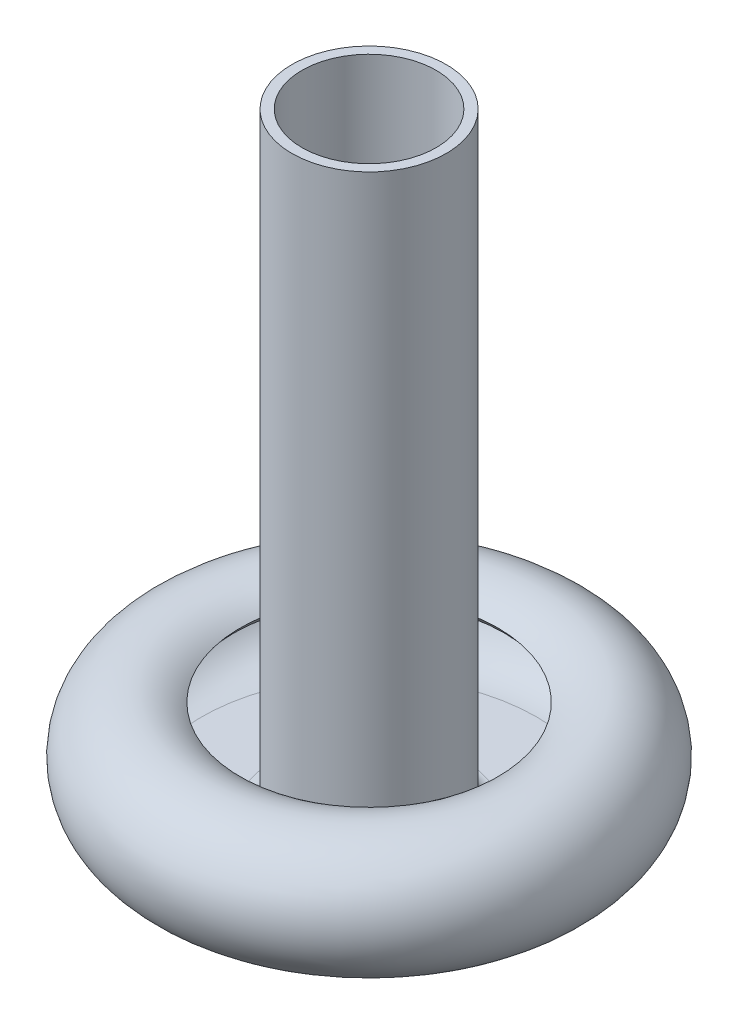
ISO-10303-21;
HEADER;
FILE_DESCRIPTION(('STEP AP214'),'2;1');
FILE_NAME('part.step','',(''),(''),'','','');
FILE_SCHEMA(('AUTOMOTIVE_DESIGN { 1 0 10303 214 1 1 1 1 }'));
ENDSEC;
DATA;
#1=APPLICATION_CONTEXT('core data for automotive mechanical design processes');
#2=APPLICATION_PROTOCOL_DEFINITION('international standard','automotive_design',2000,#1);
#3=PRODUCT_CONTEXT('',#1,'mechanical');
#4=PRODUCT('Part','Part','',(#3));
#5=PRODUCT_RELATED_PRODUCT_CATEGORY('part','',(#4));
#6=PRODUCT_DEFINITION_FORMATION('','',#4);
#7=PRODUCT_DEFINITION_CONTEXT('part definition',#1,'design');
#8=PRODUCT_DEFINITION('design','',#6,#7);
#9=PRODUCT_DEFINITION_SHAPE('','',#8);
#10=(LENGTH_UNIT() NAMED_UNIT(*) SI_UNIT(.MILLI.,.METRE.));
#11=(NAMED_UNIT(*) PLANE_ANGLE_UNIT() SI_UNIT($,.RADIAN.));
#12=(NAMED_UNIT(*) SI_UNIT($,.STERADIAN.) SOLID_ANGLE_UNIT());
#13=UNCERTAINTY_MEASURE_WITH_UNIT(LENGTH_MEASURE(1.E-05),#10,'distance_accuracy_value','');
#14=(GEOMETRIC_REPRESENTATION_CONTEXT(3) GLOBAL_UNCERTAINTY_ASSIGNED_CONTEXT((#13)) GLOBAL_UNIT_ASSIGNED_CONTEXT((#10,
#11,#12)) REPRESENTATION_CONTEXT('',''));
#15=CARTESIAN_POINT('',(0.,0.,0.));
#16=DIRECTION('',(0.,0.,1.));
#17=DIRECTION('',(1.,0.,0.));
#18=AXIS2_PLACEMENT_3D('',#15,#16,#17);
#19=CARTESIAN_POINT('',(0.,-0.15,0.));
#20=DIRECTION('',(0.,1.,0.));
#21=DIRECTION('',(0.,0.,1.));
#22=AXIS2_PLACEMENT_3D('',#19,#20,#21);
#23=PLANE('',#22);
#24=CARTESIAN_POINT('',(0.,-0.15,0.));
#25=DIRECTION('',(0.,1.,0.));
#26=DIRECTION('',(0.,0.,1.));
#27=AXIS2_PLACEMENT_3D('',#24,#25,#26);
#28=CIRCLE('',#27,1.4);
#29=CARTESIAN_POINT('',(0.,-0.15,1.4));
#30=VERTEX_POINT('',#29);
#31=EDGE_CURVE('E229',#30,#30,#28,.T.);
#32=ORIENTED_EDGE('',*,*,#31,.T.);
#33=EDGE_LOOP('',(#32));
#34=FACE_BOUND('',#33,.T.);
#35=CARTESIAN_POINT('',(0.,-0.15,0.));
#36=DIRECTION('',(0.,1.,0.));
#37=DIRECTION('',(0.,0.,1.));
#38=AXIS2_PLACEMENT_3D('',#35,#36,#37);
#39=CIRCLE('',#38,2.5);
#40=CARTESIAN_POINT('',(0.,-0.15,-2.5));
#41=VERTEX_POINT('',#40);
#42=EDGE_CURVE('E171',#41,#41,#39,.T.);
#43=ORIENTED_EDGE('',*,*,#42,.F.);
#44=EDGE_LOOP('',(#43));
#45=FACE_BOUND('',#44,.T.);
#46=ADVANCED_FACE('F163',(#34,#45),#23,.F.);
#47=CARTESIAN_POINT('',(0.,0.,0.));
#48=DIRECTION('',(0.,1.,0.));
#49=DIRECTION('',(0.,0.,1.));
#50=AXIS2_PLACEMENT_3D('',#47,#48,#49);
#51=PLANE('',#50);
#52=CARTESIAN_POINT('',(0.,0.,0.));
#53=DIRECTION('',(0.,1.,0.));
#54=DIRECTION('',(0.,0.,1.));
#55=AXIS2_PLACEMENT_3D('',#52,#53,#54);
#56=CIRCLE('',#55,1.4);
#57=CARTESIAN_POINT('',(0.,0.,1.4));
#58=VERTEX_POINT('',#57);
#59=EDGE_CURVE('E12',#58,#58,#56,.T.);
#60=ORIENTED_EDGE('',*,*,#59,.F.);
#61=EDGE_LOOP('',(#60));
#62=FACE_BOUND('',#61,.T.);
#63=CARTESIAN_POINT('',(0.,0.,0.));
#64=DIRECTION('',(0.,1.,0.));
#65=DIRECTION('',(0.,0.,1.));
#66=AXIS2_PLACEMENT_3D('',#63,#64,#65);
#67=CIRCLE('',#66,2.5);
#68=CARTESIAN_POINT('',(0.,0.,-2.5));
#69=VERTEX_POINT('',#68);
#70=EDGE_CURVE('E250',#69,#69,#67,.T.);
#71=ORIENTED_EDGE('',*,*,#70,.T.);
#72=EDGE_LOOP('',(#71));
#73=FACE_BOUND('',#72,.T.);
#74=ADVANCED_FACE('F165',(#62,#73),#51,.T.);
#75=CARTESIAN_POINT('',(0.,9.1,0.));
#76=DIRECTION('',(0.,-1.,0.));
#77=DIRECTION('',(0.,0.,-1.));
#78=AXIS2_PLACEMENT_3D('',#75,#76,#77);
#79=PLANE('',#78);
#80=CARTESIAN_POINT('',(0.,9.1,0.));
#81=DIRECTION('',(0.,1.,0.));
#82=DIRECTION('',(0.,0.,1.));
#83=AXIS2_PLACEMENT_3D('',#80,#81,#82);
#84=CIRCLE('',#83,1.15);
#85=CARTESIAN_POINT('',(0.,9.1,1.15));
#86=VERTEX_POINT('',#85);
#87=EDGE_CURVE('E234',#86,#86,#84,.T.);
#88=ORIENTED_EDGE('',*,*,#87,.T.);
#89=EDGE_LOOP('',(#88));
#90=FACE_BOUND('',#89,.T.);
#91=CARTESIAN_POINT('',(0.,9.1,0.));
#92=DIRECTION('',(0.,1.,0.));
#93=DIRECTION('',(0.,0.,1.));
#94=AXIS2_PLACEMENT_3D('',#91,#92,#93);
#95=CIRCLE('',#94,1.);
#96=CARTESIAN_POINT('',(0.,9.1,1.));
#97=VERTEX_POINT('',#96);
#98=EDGE_CURVE('E232',#97,#97,#95,.T.);
#99=ORIENTED_EDGE('',*,*,#98,.F.);
#100=EDGE_LOOP('',(#99));
#101=FACE_BOUND('',#100,.T.);
#102=ADVANCED_FACE('F255',(#90,#101),#79,.F.);
#103=CARTESIAN_POINT('',(0.,0.,0.));
#104=DIRECTION('',(0.,1.,0.));
#105=DIRECTION('',(0.,0.,1.));
#106=AXIS2_PLACEMENT_3D('',#103,#104,#105);
#107=CYLINDRICAL_SURFACE('',#106,1.);
#108=DIRECTION('',(0.,1.,0.));
#109=VECTOR('',#108,1.);
#110=CARTESIAN_POINT('',(0.,0.,1.));
#111=LINE('',#110,#109);
#112=CARTESIAN_POINT('',(0.,0.25,1.));
#113=VERTEX_POINT('',#112);
#114=EDGE_CURVE('E226',#113,#97,#111,.T.);
#115=ORIENTED_EDGE('',*,*,#114,.F.);
#116=CARTESIAN_POINT('',(0.,0.25,0.));
#117=DIRECTION('',(0.,1.,0.));
#118=DIRECTION('',(0.,0.,1.));
#119=AXIS2_PLACEMENT_3D('',#116,#117,#118);
#120=CIRCLE('',#119,1.);
#121=EDGE_CURVE('E230',#113,#113,#120,.T.);
#122=ORIENTED_EDGE('',*,*,#121,.F.);
#123=ORIENTED_EDGE('',*,*,#114,.T.);
#124=ORIENTED_EDGE('',*,*,#98,.T.);
#125=EDGE_LOOP('',(#115,#122,#123,#124));
#126=FACE_BOUND('',#125,.T.);
#127=ADVANCED_FACE('F261',(#126),#107,.F.);
#128=CARTESIAN_POINT('',(0.,0.25,0.));
#129=DIRECTION('',(0.,1.,0.));
#130=DIRECTION('',(0.,0.,1.));
#131=AXIS2_PLACEMENT_3D('',#128,#129,#130);
#132=TOROIDAL_SURFACE('',#131,1.4,0.4);
#133=CARTESIAN_POINT('',(0.,0.25,1.4));
#134=DIRECTION('',(-1.,0.,0.));
#135=DIRECTION('',(0.,0.,1.));
#136=AXIS2_PLACEMENT_3D('',#133,#134,#135);
#137=CIRCLE('',#136,0.4);
#138=EDGE_CURVE('E185',#30,#113,#137,.F.);
#139=ORIENTED_EDGE('',*,*,#138,.F.);
#140=ORIENTED_EDGE('',*,*,#31,.F.);
#141=ORIENTED_EDGE('',*,*,#138,.T.);
#142=ORIENTED_EDGE('',*,*,#121,.T.);
#143=EDGE_LOOP('',(#139,#140,#141,#142));
#144=FACE_BOUND('',#143,.T.);
#145=ADVANCED_FACE('F277',(#144),#132,.T.);
#146=CARTESIAN_POINT('',(0.,0.,0.));
#147=DIRECTION('',(0.,1.,0.));
#148=DIRECTION('',(0.,0.,1.));
#149=AXIS2_PLACEMENT_3D('',#146,#147,#148);
#150=CYLINDRICAL_SURFACE('',#149,1.15);
#151=DIRECTION('',(0.,1.,0.));
#152=VECTOR('',#151,1.);
#153=CARTESIAN_POINT('',(0.,0.,1.15));
#154=LINE('',#153,#152);
#155=CARTESIAN_POINT('',(0.,0.25,1.15));
#156=VERTEX_POINT('',#155);
#157=EDGE_CURVE('E241',#156,#86,#154,.T.);
#158=ORIENTED_EDGE('',*,*,#157,.T.);
#159=ORIENTED_EDGE('',*,*,#87,.F.);
#160=ORIENTED_EDGE('',*,*,#157,.F.);
#161=CARTESIAN_POINT('',(0.,0.25,0.));
#162=DIRECTION('',(0.,1.,0.));
#163=DIRECTION('',(0.,0.,1.));
#164=AXIS2_PLACEMENT_3D('',#161,#162,#163);
#165=CIRCLE('',#164,1.15);
#166=EDGE_CURVE('E242',#156,#156,#165,.T.);
#167=ORIENTED_EDGE('',*,*,#166,.T.);
#168=EDGE_LOOP('',(#158,#159,#160,#167));
#169=FACE_BOUND('',#168,.T.);
#170=ADVANCED_FACE('F271',(#169),#150,.T.);
#171=CARTESIAN_POINT('',(0.,0.25,0.));
#172=DIRECTION('',(0.,1.,0.));
#173=DIRECTION('',(0.,0.,1.));
#174=AXIS2_PLACEMENT_3D('',#171,#172,#173);
#175=TOROIDAL_SURFACE('',#174,1.4,0.25);
#176=CARTESIAN_POINT('',(0.,0.25,1.4));
#177=DIRECTION('',(-1.,0.,0.));
#178=DIRECTION('',(0.,0.,1.));
#179=AXIS2_PLACEMENT_3D('',#176,#177,#178);
#180=CIRCLE('',#179,0.25);
#181=EDGE_CURVE('E217',#58,#156,#180,.F.);
#182=ORIENTED_EDGE('',*,*,#181,.T.);
#183=ORIENTED_EDGE('',*,*,#166,.F.);
#184=ORIENTED_EDGE('',*,*,#181,.F.);
#185=ORIENTED_EDGE('',*,*,#59,.T.);
#186=EDGE_LOOP('',(#182,#183,#184,#185));
#187=FACE_BOUND('',#186,.T.);
#188=ADVANCED_FACE('F268',(#187),#175,.F.);
#189=CARTESIAN_POINT('',(0.,1.32453333233923,0.));
#190=DIRECTION('',(0.,-1.,0.));
#191=DIRECTION('',(0.,0.,-1.));
#192=AXIS2_PLACEMENT_3D('',#189,#190,#191);
#193=CONICAL_SURFACE('',#192,2.01790929273509,0.69813170079774);
#194=CARTESIAN_POINT('',(0.,1.43943999880708,0.));
#195=DIRECTION('',(0.,1.,0.));
#196=DIRECTION('',(0.,0.,1.));
#197=AXIS2_PLACEMENT_3D('',#194,#195,#196);
#198=CIRCLE('',#197,1.92149115128211);
#199=CARTESIAN_POINT('',(0.,1.43943999880708,-1.92149115128211));
#200=VERTEX_POINT('',#199);
#201=EDGE_CURVE('E215',#200,#200,#198,.T.);
#202=ORIENTED_EDGE('',*,*,#201,.T.);
#203=DIRECTION('',(0.,-0.766044443118973,-0.642787609686545));
#204=VECTOR('',#203,1.);
#205=CARTESIAN_POINT('',(0.,1.32453333233923,-2.01790929273509));
#206=LINE('',#205,#204);
#207=CARTESIAN_POINT('',(0.,1.32453333233923,-2.01790929273509));
#208=VERTEX_POINT('',#207);
#209=EDGE_CURVE('E211',#200,#208,#206,.T.);
#210=ORIENTED_EDGE('',*,*,#209,.T.);
#211=CARTESIAN_POINT('',(0.,1.32453333233923,0.));
#212=DIRECTION('',(0.,1.,0.));
#213=DIRECTION('',(0.,0.,-1.));
#214=AXIS2_PLACEMENT_3D('',#211,#212,#213);
#215=CIRCLE('',#214,2.01790929273509);
#216=EDGE_CURVE('E213',#208,#208,#215,.T.);
#217=ORIENTED_EDGE('',*,*,#216,.F.);
#218=ORIENTED_EDGE('',*,*,#209,.F.);
#219=EDGE_LOOP('',(#202,#210,#217,#218));
#220=FACE_BOUND('',#219,.T.);
#221=ADVANCED_FACE('F212',(#220),#193,.F.);
#222=CARTESIAN_POINT('',(0.,0.75,0.));
#223=DIRECTION('',(0.,1.,0.));
#224=DIRECTION('',(0.,0.,1.));
#225=AXIS2_PLACEMENT_3D('',#222,#223,#224);
#226=TOROIDAL_SURFACE('',#225,2.5,0.75);
#227=CARTESIAN_POINT('',(0.,0.75,-2.5));
#228=DIRECTION('',(1.,0.,0.));
#229=DIRECTION('',(0.,0.,-1.));
#230=AXIS2_PLACEMENT_3D('',#227,#228,#229);
#231=CIRCLE('',#230,0.75);
#232=EDGE_CURVE('E178',#69,#208,#231,.T.);
#233=ORIENTED_EDGE('',*,*,#232,.F.);
#234=ORIENTED_EDGE('',*,*,#70,.F.);
#235=ORIENTED_EDGE('',*,*,#232,.T.);
#236=ORIENTED_EDGE('',*,*,#216,.T.);
#237=EDGE_LOOP('',(#233,#234,#235,#236));
#238=FACE_BOUND('',#237,.T.);
#239=ADVANCED_FACE('F219',(#238),#226,.F.);
#240=CARTESIAN_POINT('',(0.,0.75,0.));
#241=DIRECTION('',(0.,1.,0.));
#242=DIRECTION('',(0.,0.,1.));
#243=AXIS2_PLACEMENT_3D('',#240,#241,#242);
#244=TOROIDAL_SURFACE('',#243,2.5,0.9);
#245=CARTESIAN_POINT('',(0.,0.75,-2.5));
#246=DIRECTION('',(1.,0.,0.));
#247=DIRECTION('',(0.,0.,-1.));
#248=AXIS2_PLACEMENT_3D('',#245,#246,#247);
#249=CIRCLE('',#248,0.9);
#250=EDGE_CURVE('E223',#41,#200,#249,.T.);
#251=ORIENTED_EDGE('',*,*,#250,.T.);
#252=ORIENTED_EDGE('',*,*,#201,.F.);
#253=ORIENTED_EDGE('',*,*,#250,.F.);
#254=ORIENTED_EDGE('',*,*,#42,.T.);
#255=EDGE_LOOP('',(#251,#252,#253,#254));
#256=FACE_BOUND('',#255,.T.);
#257=ADVANCED_FACE('F281',(#256),#244,.T.);
#258=CLOSED_SHELL('',(#46,#74,#102,#127,#145,#170,#188,#221,#239,#257));
#259=MANIFOLD_SOLID_BREP('B2',#258);
#260=ADVANCED_BREP_SHAPE_REPRESENTATION('',(#18,#259),#14);
#261=SHAPE_DEFINITION_REPRESENTATION(#9,#260);
ENDSEC;
END-ISO-10303-21;
